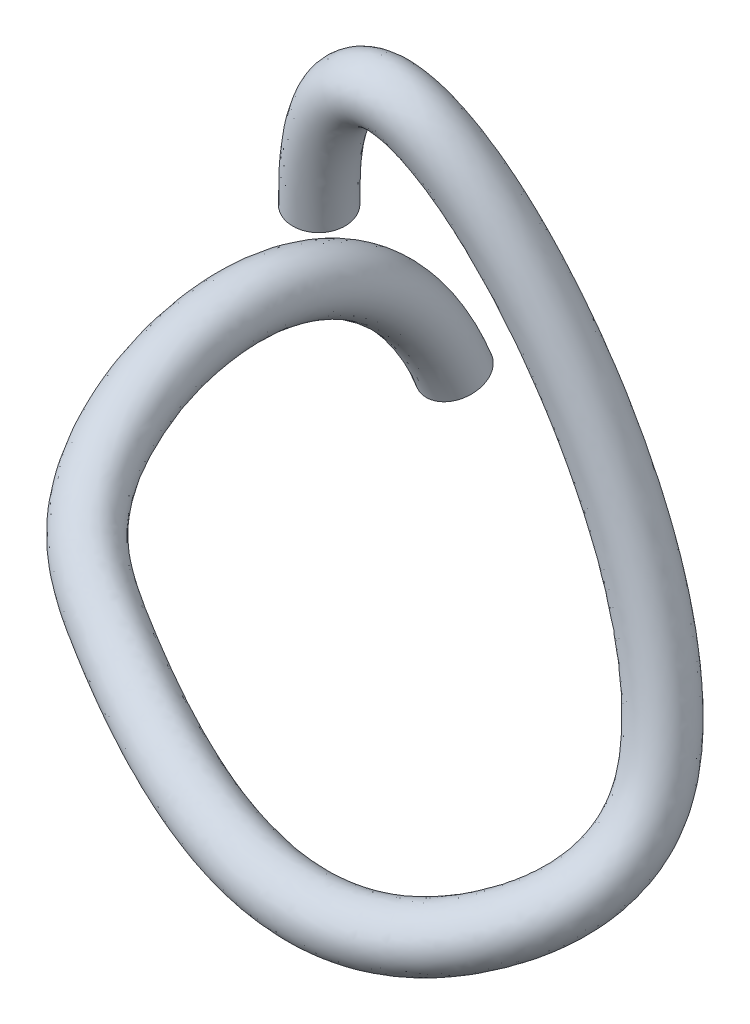
ISO-10303-21;
HEADER;
FILE_DESCRIPTION(('STEP AP214'),'2;1');
FILE_NAME('part.step','',(''),(''),'','','');
FILE_SCHEMA(('AUTOMOTIVE_DESIGN { 1 0 10303 214 1 1 1 1 }'));
ENDSEC;
DATA;
#1=APPLICATION_CONTEXT('core data for automotive mechanical design processes');
#2=APPLICATION_PROTOCOL_DEFINITION('international standard','automotive_design',2000,#1);
#3=PRODUCT_CONTEXT('',#1,'mechanical');
#4=PRODUCT('Part','Part','',(#3));
#5=PRODUCT_RELATED_PRODUCT_CATEGORY('part','',(#4));
#6=PRODUCT_DEFINITION_FORMATION('','',#4);
#7=PRODUCT_DEFINITION_CONTEXT('part definition',#1,'design');
#8=PRODUCT_DEFINITION('design','',#6,#7);
#9=PRODUCT_DEFINITION_SHAPE('','',#8);
#10=(LENGTH_UNIT() NAMED_UNIT(*) SI_UNIT(.MILLI.,.METRE.));
#11=(NAMED_UNIT(*) PLANE_ANGLE_UNIT() SI_UNIT($,.RADIAN.));
#12=(NAMED_UNIT(*) SI_UNIT($,.STERADIAN.) SOLID_ANGLE_UNIT());
#13=UNCERTAINTY_MEASURE_WITH_UNIT(LENGTH_MEASURE(1.E-05),#10,'distance_accuracy_value','');
#14=(GEOMETRIC_REPRESENTATION_CONTEXT(3) GLOBAL_UNCERTAINTY_ASSIGNED_CONTEXT((#13)) GLOBAL_UNIT_ASSIGNED_CONTEXT((#10,
#11,#12)) REPRESENTATION_CONTEXT('',''));
#15=CARTESIAN_POINT('',(0.,0.,0.));
#16=DIRECTION('',(0.,0.,1.));
#17=DIRECTION('',(1.,0.,0.));
#18=AXIS2_PLACEMENT_3D('',#15,#16,#17);
#19=CARTESIAN_POINT('',(-13.0347942416813,-226.512822725171,50.1244016321392));
#20=DIRECTION('',(-0.0721003246890326,0.938055885866754,0.338899244865603));
#21=DIRECTION('',(0.,-0.339783570756016,0.940503654987205));
#22=AXIS2_PLACEMENT_3D('',#19,#20,#21);
#23=PLANE('',#22);
#24=CARTESIAN_POINT('',(-13.0347942416813,-226.512822725171,50.1244016321392));
#25=DIRECTION('',(-0.0721003246890326,0.938055885866754,0.338899244865603));
#26=DIRECTION('',(0.,-0.339783570756016,0.940503654987205));
#27=AXIS2_PLACEMENT_3D('',#24,#25,#26);
#28=CIRCLE('',#27,1.25);
#29=CARTESIAN_POINT('',(-13.0347942416813,-226.937552188616,51.3000312008732));
#30=VERTEX_POINT('',#29);
#31=EDGE_CURVE('E48',#30,#30,#28,.T.);
#32=ORIENTED_EDGE('',*,*,#31,.F.);
#33=EDGE_LOOP('',(#32));
#34=FACE_BOUND('',#33,.T.);
#35=ADVANCED_FACE('F41',(#34),#23,.F.);
#36=CARTESIAN_POINT('',(-3.27200878484372,-207.550376313092,65.7574694621777));
#37=DIRECTION('',(-0.0945658701813724,-0.989253149180793,-0.111514586636561));
#38=DIRECTION('',(0.467990372308488,0.054692128097858,-0.882039558381986));
#39=AXIS2_PLACEMENT_3D('',#36,#37,#38);
#40=PLANE('',#39);
#41=CARTESIAN_POINT('',(-3.27200878484372,-207.550376313092,65.7574694621777));
#42=DIRECTION('',(-0.0945658701813724,-0.989253149180793,-0.111514586636561));
#43=DIRECTION('',(0.467990372308488,0.054692128097858,-0.882039558381986));
#44=AXIS2_PLACEMENT_3D('',#41,#42,#43);
#45=CIRCLE('',#44,1.25);
#46=CARTESIAN_POINT('',(-2.68702081945811,-207.48201115297,64.6549200142002));
#47=VERTEX_POINT('',#46);
#48=EDGE_CURVE('E12',#47,#47,#45,.T.);
#49=ORIENTED_EDGE('',*,*,#48,.T.);
#50=EDGE_LOOP('',(#49));
#51=FACE_BOUND('',#50,.T.);
#52=ADVANCED_FACE('F55',(#51),#40,.T.);
#53=CARTESIAN_POINT('',(-13.0347942416813,-226.937552188616,51.3000312008732));
#54=CARTESIAN_POINT('',(-13.1690798212002,-224.76631906985,52.084450636396));
#55=CARTESIAN_POINT('',(-13.3466605089802,-223.494945827811,53.1496145481935));
#56=CARTESIAN_POINT('',(-13.6176370953907,-221.9748409091,55.492303441265));
#57=CARTESIAN_POINT('',(-13.719968757025,-221.708627472003,56.8187300855496));
#58=CARTESIAN_POINT('',(-13.6693163469916,-221.748257150503,58.9272635334938));
#59=CARTESIAN_POINT('',(-13.6166102951518,-221.835587653315,59.6449846491448));
#60=CARTESIAN_POINT('',(-13.4301436293276,-222.099472792696,61.0586234307728));
#61=CARTESIAN_POINT('',(-13.2972780490025,-222.274552752187,61.754991806822));
#62=CARTESIAN_POINT('',(-12.9728804612941,-222.674799221792,63.0647972710129));
#63=CARTESIAN_POINT('',(-12.782650472939,-222.90253638215,63.6775997819816));
#64=CARTESIAN_POINT('',(-12.3460506194197,-223.385018493212,64.7422225343464));
#65=CARTESIAN_POINT('',(-12.0974562343204,-223.638544362689,65.1923850043142));
#66=CARTESIAN_POINT('',(-11.6770116327616,-223.994686494845,65.7136768213109));
#67=CARTESIAN_POINT('',(-11.5166489903006,-224.110737381236,65.8769367592622));
#68=CARTESIAN_POINT('',(-11.2476827252521,-224.270788829762,66.1210171185453));
#69=CARTESIAN_POINT('',(-11.1533269946278,-224.321776425026,66.2022049324256));
#70=CARTESIAN_POINT('',(-10.9555780864416,-224.416897287701,66.3693314516303));
#71=CARTESIAN_POINT('',(-10.8522278202061,-224.459340416791,66.4576496603135));
#72=CARTESIAN_POINT('',(-10.5375645712517,-224.628261446071,66.6799852633233));
#73=CARTESIAN_POINT('',(-10.3176733701941,-224.784213740087,66.7775896445653));
#74=CARTESIAN_POINT('',(-9.84495487862731,-225.070963832184,66.9897990615661));
#75=CARTESIAN_POINT('',(-9.59383216866633,-225.212154383585,67.0945263043057));
#76=CARTESIAN_POINT('',(-7.97766933700305,-226.055607980373,67.7693424327877));
#77=CARTESIAN_POINT('',(-6.47183229033444,-226.574553732821,68.402568755281));
#78=CARTESIAN_POINT('',(-4.13902735044166,-227.098328901101,69.2633241053463));
#79=CARTESIAN_POINT('',(-3.3492040202668,-227.230581173186,69.5353723483892));
#80=CARTESIAN_POINT('',(-2.16674494678162,-227.369814967006,69.8976036968864));
#81=CARTESIAN_POINT('',(-1.77313125231292,-227.404846318559,70.0113750007578));
#82=CARTESIAN_POINT('',(-0.982078892198437,-227.512883271243,70.1753355992218));
#83=CARTESIAN_POINT('',(-0.58720038448331,-227.571232406946,70.2396605741553));
#84=CARTESIAN_POINT('',(1.36037565532965,-227.779485220413,70.546191718046));
#85=CARTESIAN_POINT('',(2.84554819546331,-227.76939869547,70.6563760304991));
#86=CARTESIAN_POINT('',(4.80327750262762,-227.553034866903,70.4291402402458));
#87=CARTESIAN_POINT('',(5.41092588924908,-227.448884685819,70.2899660074702));
#88=CARTESIAN_POINT('',(6.25095151613049,-227.253895249537,69.9707786883891));
#89=CARTESIAN_POINT('',(6.51927955821612,-227.182370047776,69.8459610517992));
#90=CARTESIAN_POINT('',(7.03391180615321,-227.026593768275,69.5552656222028));
#91=CARTESIAN_POINT('',(7.28144172655081,-226.946907473032,69.3883603640673));
#92=CARTESIAN_POINT('',(8.19101129644953,-226.557461743263,68.6586777380479));
#93=CARTESIAN_POINT('',(8.82281294284266,-226.200524744857,67.8726849736074));
#94=CARTESIAN_POINT('',(9.47504844203213,-225.303072024909,66.6777740701201));
#95=CARTESIAN_POINT('',(9.64485672902227,-224.942972785224,66.2767216843067));
#96=CARTESIAN_POINT('',(9.85800472199643,-224.045106535431,65.5266825254428));
#97=CARTESIAN_POINT('',(9.90130851748301,-223.506728234627,65.1773634678194));
#98=CARTESIAN_POINT('',(9.80770671590474,-221.874109477864,64.4554722936217));
#99=CARTESIAN_POINT('',(9.57206357289042,-220.646864929803,64.1612416050175));
#100=CARTESIAN_POINT('',(8.82267439001896,-217.918075184918,63.7951025071716));
#101=CARTESIAN_POINT('',(8.30935303737227,-216.416745917683,63.7226206697046));
#102=CARTESIAN_POINT('',(7.09393413734342,-213.365591653081,63.7345160479404));
#103=CARTESIAN_POINT('',(6.39173705074274,-211.815575420424,63.8188401649754));
#104=CARTESIAN_POINT('',(5.45345913016973,-209.98890253157,63.9803037118888));
#105=CARTESIAN_POINT('',(5.26252766533159,-209.629343021333,64.0161221600944));
#106=CARTESIAN_POINT('',(4.87724247340856,-208.924019671841,64.0893111871977));
#107=CARTESIAN_POINT('',(4.68892267651283,-208.572999154489,64.1097097943609));
#108=CARTESIAN_POINT('',(4.12532309533547,-207.540107295297,64.1653266959525));
#109=CARTESIAN_POINT('',(3.74358534064665,-206.885824089556,64.2145071262359));
#110=CARTESIAN_POINT('',(2.59422862812943,-205.075143760298,64.3883505182109));
#111=CARTESIAN_POINT('',(1.81649244943295,-204.071435259621,64.5405236135607));
#112=CARTESIAN_POINT('',(0.751870708468586,-203.064457627526,64.7478982977373));
#113=CARTESIAN_POINT('',(0.415007094224127,-202.81291549402,64.8131347028483));
#114=CARTESIAN_POINT('',(-0.171978771830177,-202.493703368036,64.9193998067493));
#115=CARTESIAN_POINT('',(-0.415425350955713,-202.428535692913,64.9590376902359));
#116=CARTESIAN_POINT('',(-0.786959570439137,-202.417135825651,65.009880192269));
#117=CARTESIAN_POINT('',(-0.924273337235937,-202.453130160138,65.0244816337622));
#118=CARTESIAN_POINT('',(-1.27217598950491,-202.697000163808,65.0460814623679));
#119=CARTESIAN_POINT('',(-1.4799189917512,-202.924750302478,65.0504901953339));
#120=CARTESIAN_POINT('',(-1.89331068788754,-203.694465765578,65.019600735039));
#121=CARTESIAN_POINT('',(-2.09506348981743,-204.230373145043,64.9843143778643));
#122=CARTESIAN_POINT('',(-2.43926585104946,-205.61713220408,64.8609420953337));
#123=CARTESIAN_POINT('',(-2.58281647181509,-206.467343193548,64.7731244415885));
#124=CARTESIAN_POINT('',(-2.6870208194581,-207.48201115297,64.6549200142002));
#125=CARTESIAN_POINT('',(-10.541300779714,-226.768025641377,51.361277465312));
#126=CARTESIAN_POINT('',(-10.6810241193302,-224.503949720436,52.1100979920895));
#127=CARTESIAN_POINT('',(-10.8730608255717,-223.102877882465,53.1684901487536));
#128=CARTESIAN_POINT('',(-11.2086626957866,-221.294058852035,55.5707068015353));
#129=CARTESIAN_POINT('',(-11.3513173990001,-220.871226589479,56.9429567256571));
#130=CARTESIAN_POINT('',(-11.4815658807695,-220.555279725331,59.171902435251));
#131=CARTESIAN_POINT('',(-11.5128297354039,-220.502436265268,59.9420616712864));
#132=CARTESIAN_POINT('',(-11.5706544640441,-220.475792859077,61.5029245994777));
#133=CARTESIAN_POINT('',(-11.6010557112487,-220.503232425246,62.2949864851014));
#134=CARTESIAN_POINT('',(-11.6386854195622,-220.686726169212,63.8223124863836));
#135=CARTESIAN_POINT('',(-11.6420882089123,-220.848579524687,64.5547177890014));
#136=CARTESIAN_POINT('',(-11.5228465122676,-221.291590411002,65.8507580221724));
#137=CARTESIAN_POINT('',(-11.3984458570942,-221.56817126276,66.4142010268368));
#138=CARTESIAN_POINT('',(-11.0871309651592,-221.993188781706,67.0923941848591));
#139=CARTESIAN_POINT('',(-10.9689737864074,-222.137521744089,67.3147786611481));
#140=CARTESIAN_POINT('',(-10.789921607579,-222.361877166065,67.6699652646272));
#141=CARTESIAN_POINT('',(-10.7299198694282,-222.438064371471,67.79193165938));
#142=CARTESIAN_POINT('',(-10.6147828795726,-222.597683274898,68.0513524751523));
#143=CARTESIAN_POINT('',(-10.5630198030478,-222.6834188203,68.1939740606117));
#144=CARTESIAN_POINT('',(-10.3275532763132,-222.933230401469,68.5081565013111));
#145=CARTESIAN_POINT('',(-10.0839589465742,-223.078424574689,68.5902606749585));
#146=CARTESIAN_POINT('',(-9.62822084060818,-223.354625214621,68.7946047236319));
#147=CARTESIAN_POINT('',(-9.39683707007131,-223.484134147521,68.8907862890007));
#148=CARTESIAN_POINT('',(-7.9725393625002,-224.22745501154,69.4854896528661));
#149=CARTESIAN_POINT('',(-6.57996834568991,-224.715186573624,70.0722857361876));
#150=CARTESIAN_POINT('',(-4.36152550266758,-225.213324756328,70.8908920934721));
#151=CARTESIAN_POINT('',(-3.60054778906595,-225.341279340503,71.1533315013584));
#152=CARTESIAN_POINT('',(-2.44756073998767,-225.477097936733,71.5066007339115));
#153=CARTESIAN_POINT('',(-2.06101353523742,-225.512953582119,71.6215689279857));
#154=CARTESIAN_POINT('',(-1.24950272779816,-225.5327910033,71.6795223874102));
#155=CARTESIAN_POINT('',(-0.839089091593463,-225.53055006371,71.6638955333949));
#156=CARTESIAN_POINT('',(1.14711122493716,-225.520348373061,71.6422118267606));
#157=CARTESIAN_POINT('',(2.59921743603147,-225.43991500494,71.5436374588772));
#158=CARTESIAN_POINT('',(4.45262941821452,-225.172751911377,71.1128071633246));
#159=CARTESIAN_POINT('',(5.01645700942624,-225.061824960932,70.9223788664973));
#160=CARTESIAN_POINT('',(5.78472743169138,-224.866534820615,70.5487464631963));
#161=CARTESIAN_POINT('',(6.02817182104778,-224.796582160494,70.4095110045112));
#162=CARTESIAN_POINT('',(6.49267657655975,-224.646525053357,70.0966495345879));
#163=CARTESIAN_POINT('',(6.70851736429149,-224.571007032114,69.9147845529127));
#164=CARTESIAN_POINT('',(7.57094670107289,-224.201731209992,69.2228513825563));
#165=CARTESIAN_POINT('',(8.03404234379778,-223.904010407858,68.5989059849554));
#166=CARTESIAN_POINT('',(8.43604593935213,-223.350584206655,67.861686491109));
#167=CARTESIAN_POINT('',(8.52445362177333,-223.154191934073,67.6466596895161));
#168=CARTESIAN_POINT('',(8.63492130999744,-222.688210286839,67.257193926087));
#169=CARTESIAN_POINT('',(8.65978943807679,-222.417083409995,67.0766450422916));
#170=CARTESIAN_POINT('',(8.60440063910574,-221.450985470985,66.6494676549402));
#171=CARTESIAN_POINT('',(8.43326591890644,-220.465652645329,66.3872629553424));
#172=CARTESIAN_POINT('',(7.78198323127419,-218.094009252198,66.0690590074159));
#173=CARTESIAN_POINT('',(7.31182285948146,-216.709794136406,65.9986066066366));
#174=CARTESIAN_POINT('',(6.17423846025647,-213.8539960097,66.009747189274));
#175=CARTESIAN_POINT('',(5.50716526394915,-212.379987318661,66.0893979458974));
#176=CARTESIAN_POINT('',(4.61466533156803,-210.642405748342,66.2429928865646));
#177=CARTESIAN_POINT('',(4.43430836226741,-210.299673989056,66.2777821571881));
#178=CARTESIAN_POINT('',(4.06527188163111,-209.630368214622,66.3458953882653));
#179=CARTESIAN_POINT('',(3.85210702023676,-209.313841939638,66.3466696870516));
#180=CARTESIAN_POINT('',(3.19716957379296,-208.397636493784,66.3253190250452));
#181=CARTESIAN_POINT('',(2.76668932551185,-207.820010294296,66.319914017756));
#182=CARTESIAN_POINT('',(1.52231551775178,-206.239933607139,66.3334310754509));
#183=CARTESIAN_POINT('',(0.738693338791091,-205.389711397094,66.3882446694281));
#184=CARTESIAN_POINT('',(-0.129848158447466,-204.67238019995,66.451732452925));
#185=CARTESIAN_POINT('',(-0.365733718586637,-204.530317714242,66.4680982923781));
#186=CARTESIAN_POINT('',(-0.591565394208493,-204.430326615694,66.4593246234741));
#187=CARTESIAN_POINT('',(-0.559020528139004,-204.480878267273,66.4294499434642));
#188=CARTESIAN_POINT('',(-0.183474799502697,-204.484459522868,66.3353311997143));
#189=CARTESIAN_POINT('',(0.128369444035149,-204.377492765231,66.2825279478304));
#190=CARTESIAN_POINT('',(0.394943463970075,-204.182010715477,66.2332484445985));
#191=CARTESIAN_POINT('',(0.35928747485309,-204.160595302125,66.2280151225327));
#192=CARTESIAN_POINT('',(0.155937902550499,-204.553509921655,66.1854402042996));
#193=CARTESIAN_POINT('',(0.00140650701237655,-204.947385250514,66.1481326284211));
#194=CARTESIAN_POINT('',(-0.274859115599343,-206.109672497514,66.0170187705476));
#195=CARTESIAN_POINT('',(-0.400302410000975,-206.875918733193,65.92411615686));
#196=CARTESIAN_POINT('',(-0.490372367236806,-207.821007631196,65.7993923664673));
#197=CARTESIAN_POINT('',(-10.541300779714,-225.918566714487,49.0100183278439));
#198=CARTESIAN_POINT('',(-10.7764604415032,-223.261064932097,49.9009750823326));
#199=CARTESIAN_POINT('',(-11.1102412084608,-221.354403057542,51.2962991246934));
#200=CARTESIAN_POINT('',(-11.8151747440314,-218.953430037249,54.6920044242868));
#201=CARTESIAN_POINT('',(-12.1675455352585,-218.478997366816,56.6230078043129));
#202=CARTESIAN_POINT('',(-12.6975319637898,-218.372880660613,59.434390326209));
#203=CARTESIAN_POINT('',(-12.8798296381704,-218.43592778752,60.3659575114798));
#204=CARTESIAN_POINT('',(-13.250578887104,-218.737143847921,62.1912466504032));
#205=CARTESIAN_POINT('',(-13.4410807750773,-218.979501667813,63.0854253944296));
#206=CARTESIAN_POINT('',(-13.7214521323526,-219.653335134803,64.7848233250445));
#207=CARTESIAN_POINT('',(-13.8048918999445,-220.085468680641,65.5884528711494));
#208=CARTESIAN_POINT('',(-13.7196711826948,-221.061850438838,67.0548539896595));
#209=CARTESIAN_POINT('',(-13.5537035750034,-221.603960157446,67.7207491931765));
#210=CARTESIAN_POINT('',(-13.0510705150474,-222.439071999776,68.5830202533597));
#211=CARTESIAN_POINT('',(-12.8632133916501,-222.725598951653,68.8453460104686));
#212=CARTESIAN_POINT('',(-12.5894392152431,-223.175545330449,69.205000840023));
#213=CARTESIAN_POINT('',(-12.4994279771059,-223.329030333116,69.319290779616));
#214=CARTESIAN_POINT('',(-12.328316057422,-223.651332169049,69.5384413086769));
#215=CARTESIAN_POINT('',(-12.2505017213794,-223.825833127925,69.6437100404706));
#216=CARTESIAN_POINT('',(-11.9275221804759,-224.249768607595,69.9133565665157));
#217=CARTESIAN_POINT('',(-11.6210383756641,-224.412383424923,70.0433882595319));
#218=CARTESIAN_POINT('',(-11.0689669848621,-224.746792426489,70.2911875567547));
#219=CARTESIAN_POINT('',(-10.8007302308048,-224.896303572975,70.4026524099439));
#220=CARTESIAN_POINT('',(-9.22510861597287,-225.718597488233,71.0605406892903));
#221=CARTESIAN_POINT('',(-7.70313158693602,-226.251168279847,71.7019076966928));
#222=CARTESIAN_POINT('',(-5.26092801245934,-226.799590969925,72.603035611134));
#223=CARTESIAN_POINT('',(-4.42018167375,-226.941275747447,72.8931387725492));
#224=CARTESIAN_POINT('',(-3.13411653158656,-227.09282889913,73.2871158247516));
#225=CARTESIAN_POINT('',(-2.70065241453656,-227.136164227881,73.4141866130163));
#226=CARTESIAN_POINT('',(-1.8059273394939,-227.055365087648,73.5846703192508));
#227=CARTESIAN_POINT('',(-1.35409602854429,-226.974320833264,73.6411997620675));
#228=CARTESIAN_POINT('',(0.870583163827964,-226.641476122046,73.8933484088054));
#229=CARTESIAN_POINT('',(2.58807311065107,-226.350346914475,73.909084084077));
#230=CARTESIAN_POINT('',(4.98834135129146,-225.777992487375,73.4877352909606));
#231=CARTESIAN_POINT('',(5.75909740841952,-225.564123624503,73.2694907627717));
#232=CARTESIAN_POINT('',(6.84727054322133,-225.202460381383,72.7901398669274));
#233=CARTESIAN_POINT('',(7.19847952546943,-225.075192704942,72.6050342952008));
#234=CARTESIAN_POINT('',(7.87217245579702,-224.807530354864,72.1795885369125));
#235=CARTESIAN_POINT('',(8.1869854019678,-224.662592543005,71.933064313552));
#236=CARTESIAN_POINT('',(9.43257223789835,-224.1291950507,70.9337529949111));
#237=CARTESIAN_POINT('',(10.0330073815259,-223.731639918324,70.1049576873804));
#238=CARTESIAN_POINT('',(10.5603809152286,-223.005164228053,69.1379415940063));
#239=CARTESIAN_POINT('',(10.6738568054488,-222.748420073055,68.8594191939055));
#240=CARTESIAN_POINT('',(10.8104814141375,-222.171623925533,68.3776613435294));
#241=CARTESIAN_POINT('',(10.8365100885872,-221.851257034447,68.1689805096336));
#242=CARTESIAN_POINT('',(10.7761258063296,-220.798028796891,67.7032771311739));
#243=CARTESIAN_POINT('',(10.5955037924885,-219.771980133085,67.4337086760736));
#244=CARTESIAN_POINT('',(9.92387126527535,-217.326190368767,67.1055302490327));
#245=CARTESIAN_POINT('',(9.44199896584185,-215.908112841053,67.033613984495));
#246=CARTESIAN_POINT('',(8.27496925784188,-212.978378518516,67.0450285716685));
#247=CARTESIAN_POINT('',(7.59036175144624,-211.464678495349,67.1265233996176));
#248=CARTESIAN_POINT('',(6.66602790455282,-209.665106907739,67.2855829359941));
#249=CARTESIAN_POINT('',(6.47930695513218,-209.308892954809,67.3201774643246));
#250=CARTESIAN_POINT('',(6.09400798745263,-208.612808867792,67.3942546144145));
#251=CARTESIAN_POINT('',(5.85887675695586,-208.293499825513,67.4351315193525));
#252=CARTESIAN_POINT('',(5.12383030116242,-207.380541094435,67.556328065671));
#253=CARTESIAN_POINT('',(4.63663306469888,-206.805702492911,67.6365249434567));
#254=CARTESIAN_POINT('',(3.21706040256968,-205.21953383865,67.873730080925));
#255=CARTESIAN_POINT('',(2.32185599835922,-204.34493859677,68.0310962399079));
#256=CARTESIAN_POINT('',(1.18581193444894,-203.502230106383,68.2297977340163));
#257=CARTESIAN_POINT('',(0.842044217518011,-203.301533100521,68.2889476189025));
#258=CARTESIAN_POINT('',(0.28332835334236,-203.074077008461,68.3774693775272));
#259=CARTESIAN_POINT('',(0.0775198288966146,-203.050793518194,68.4048877204846));
#260=CARTESIAN_POINT('',(-0.1762453446901,-203.081146013576,68.4289737535316));
#261=CARTESIAN_POINT('',(-0.236906378412235,-203.110332537836,68.4302886236323));
#262=CARTESIAN_POINT('',(-0.46892801851899,-203.310471018077,68.4346439552822));
#263=CARTESIAN_POINT('',(-0.636366173298213,-203.50877387257,68.4341066669617));
#264=CARTESIAN_POINT('',(-0.985853143004668,-204.234535419656,68.3939704376251));
#265=CARTESIAN_POINT('',(-1.16253156363872,-204.753655274629,68.3543818519005));
#266=CARTESIAN_POINT('',(-1.45833127685155,-206.113147866679,68.2213781658164));
#267=CARTESIAN_POINT('',(-1.57895951736781,-206.952636292893,68.1283301930753));
#268=CARTESIAN_POINT('',(-1.66034829800802,-207.957737951441,68.0044912624222));
#269=CARTESIAN_POINT('',(-13.0347942416813,-226.088093261726,48.9487720634052));
#270=CARTESIAN_POINT('',(-13.2645161433743,-223.523434281353,49.8753277266522));
#271=CARTESIAN_POINT('',(-13.5838408918722,-221.746471002899,51.2774235241216));
#272=CARTESIAN_POINT('',(-14.2241491436324,-219.634212094303,54.6136010640282));
#273=CARTESIAN_POINT('',(-14.5361968932835,-219.316398249329,56.4987811641943));
#274=CARTESIAN_POINT('',(-14.8852824300119,-219.565858085791,59.1897514244574));
#275=CARTESIAN_POINT('',(-14.9836101979197,-219.769079175562,60.0688804893327));
#276=CARTESIAN_POINT('',(-15.1100680523861,-220.360823781545,61.746945481704));
#277=CARTESIAN_POINT('',(-15.1373031128312,-220.750821994749,62.5454307161449));
#278=CARTESIAN_POINT('',(-15.0556471740844,-221.641408187388,64.0273081096792));
#279=CARTESIAN_POINT('',(-14.9454541639712,-222.1394255381,64.7113348641347));
#280=CARTESIAN_POINT('',(-14.542875289847,-223.155278521054,65.9463185018286));
#281=CARTESIAN_POINT('',(-14.2527139522274,-223.674333257375,66.4989331706539));
#282=CARTESIAN_POINT('',(-13.640951182651,-224.440569712915,67.2043028898116));
#283=CARTESIAN_POINT('',(-13.4108885955422,-224.6988145888,67.4075041085783));
#284=CARTESIAN_POINT('',(-13.0472003329167,-225.084456994147,67.6560526939434));
#285=CARTESIAN_POINT('',(-12.9228351023058,-225.212742386671,67.7295640526617));
#286=CARTESIAN_POINT('',(-12.6691112642907,-225.470546181852,67.8564202851549));
#287=CARTESIAN_POINT('',(-12.5397097385382,-225.601754724415,67.9073856401725));
#288=CARTESIAN_POINT('',(-12.1375334754132,-225.944799652199,68.0851853285279));
#289=CARTESIAN_POINT('',(-11.8547527992806,-226.118172590321,68.230717229141));
#290=CARTESIAN_POINT('',(-11.2857010228846,-226.463131044053,68.4863818946866));
#291=CARTESIAN_POINT('',(-10.9977253293999,-226.624323809042,68.6063924252489));
#292=CARTESIAN_POINT('',(-9.23023859047573,-227.546750457054,69.3443934692119));
#293=CARTESIAN_POINT('',(-7.59499553156818,-228.110535439069,70.0321907157739));
#294=CARTESIAN_POINT('',(-5.03842986023952,-228.684595114685,70.9754676230145));
#295=CARTESIAN_POINT('',(-4.16883790495693,-228.830577580125,71.2751796195921));
#296=CARTESIAN_POINT('',(-2.85330073837746,-228.985545929405,71.6781187877204));
#297=CARTESIAN_POINT('',(-2.41277013160906,-229.028056964315,71.8039926857884));
#298=CARTESIAN_POINT('',(-1.53850350389718,-229.035457355597,72.0804835310623));
#299=CARTESIAN_POINT('',(-1.10220732143115,-229.015003176497,72.2169648028279));
#300=CARTESIAN_POINT('',(1.08384759420877,-228.90061296941,72.7973283000908));
#301=CARTESIAN_POINT('',(2.83440387009345,-228.679830605005,73.0218226556883));
#302=CARTESIAN_POINT('',(5.33898943569933,-228.1582754429,72.8040683678871));
#303=CARTESIAN_POINT('',(6.15356628823732,-227.95118334939,72.6370779037472));
#304=CARTESIAN_POINT('',(7.31349462766304,-227.589820810305,72.2121720921189));
#305=CARTESIAN_POINT('',(7.68958726264039,-227.460980592224,72.0414843424888));
#306=CARTESIAN_POINT('',(8.41340768538797,-227.187599069783,71.6382046245274));
#307=CARTESIAN_POINT('',(8.75990976422447,-227.03849298392,71.4066401247092));
#308=CARTESIAN_POINT('',(10.0526368332827,-226.484925583978,70.369579350395));
#309=CARTESIAN_POINT('',(10.8217779805626,-226.028154255322,69.3787366760365));
#310=CARTESIAN_POINT('',(11.5993834179127,-224.957652046307,67.9540291730153));
#311=CARTESIAN_POINT('',(11.7942599127021,-224.537200924215,67.4894811886961));
#312=CARTESIAN_POINT('',(12.0335648261321,-223.528520174116,66.6471499428851));
#313=CARTESIAN_POINT('',(12.0780291679934,-222.940901859089,66.2696989351589));
#314=CARTESIAN_POINT('',(11.9794318831286,-221.221152803754,65.5092817698593));
#315=CARTESIAN_POINT('',(11.734301446475,-219.953192417579,65.2076873257487));
#316=CARTESIAN_POINT('',(10.9645624240176,-217.150256301466,64.8315737487884));
#317=CARTESIAN_POINT('',(10.4395291437298,-215.615064622331,64.7576280475629));
#318=CARTESIAN_POINT('',(9.1946649349317,-212.489974161897,64.7697974303349));
#319=CARTESIAN_POINT('',(8.47493353823692,-210.900266597112,64.8559656186956));
#320=CARTESIAN_POINT('',(7.50482170315523,-209.011603690967,65.0228937613183));
#321=CARTESIAN_POINT('',(7.30752625819707,-208.638561987083,65.0585174672309));
#322=CARTESIAN_POINT('',(6.90597857922937,-207.906460325014,65.1376704133469));
#323=CARTESIAN_POINT('',(6.69569241323263,-207.552657040366,65.1981716266604));
#324=CARTESIAN_POINT('',(6.05198382270354,-206.523011895941,65.3963357365811));
#325=CARTESIAN_POINT('',(5.6135290798324,-205.871516288166,65.5311180519366));
#326=CARTESIAN_POINT('',(4.28897351294989,-204.054743991819,65.928649523685));
#327=CARTESIAN_POINT('',(3.3996551089973,-203.026662459275,66.1833751840254));
#328=CARTESIAN_POINT('',(2.06753080136686,-201.89430753397,66.5259635788362));
#329=CARTESIAN_POINT('',(1.62278503032727,-201.584130880296,66.6339840293728));
#330=CARTESIAN_POINT('',(0.702914975722153,-201.137453760806,66.8375445608024));
#331=CARTESIAN_POINT('',(0.221115006082319,-200.998450943833,66.9344754672538));
#332=CARTESIAN_POINT('',(-0.779730115628953,-201.013822316359,67.1035227460887));
#333=CARTESIAN_POINT('',(-1.28954915967819,-201.185969932743,67.1722423095641));
#334=CARTESIAN_POINT('',(-2.13604747199916,-201.825460466408,67.2474769730516));
#335=CARTESIAN_POINT('',(-2.47557263990436,-202.272928872923,67.256581739763));
#336=CARTESIAN_POINT('',(-3.0351017334409,-203.37549126358,67.2281309683645));
#337=CARTESIAN_POINT('',(-3.2590015604712,-204.036643169157,67.1905636013437));
#338=CARTESIAN_POINT('',(-3.62273801229902,-205.620607573245,67.0653014906026));
#339=CARTESIAN_POINT('',(-3.76147357918926,-206.544060753248,66.9773384778148));
#340=CARTESIAN_POINT('',(-3.85699675022933,-207.618741473214,66.8600189101552));
#341=CARTESIAN_POINT('',(-15.5282877036485,-226.257619808966,48.8875257989664));
#342=CARTESIAN_POINT('',(-15.7525718452454,-223.785803630609,49.8496803709719));
#343=CARTESIAN_POINT('',(-16.0574405752837,-222.138538948257,51.2585479235497));
#344=CARTESIAN_POINT('',(-16.6331235432335,-220.314994151356,54.5351977037696));
#345=CARTESIAN_POINT('',(-16.9048482513084,-220.153799131842,56.3745545240756));
#346=CARTESIAN_POINT('',(-17.0730328962339,-220.758835510969,58.9451125227057));
#347=CARTESIAN_POINT('',(-17.0873907576689,-221.102230563603,59.7718034671854));
#348=CARTESIAN_POINT('',(-16.9695572176682,-221.98450371517,61.3026443130047));
#349=CARTESIAN_POINT('',(-16.833525450585,-222.522142321685,62.0054360378602));
#350=CARTESIAN_POINT('',(-16.3898422158163,-223.629481239973,63.2697928943139));
#351=CARTESIAN_POINT('',(-16.0860164279979,-224.193382395558,63.8342168571199));
#352=CARTESIAN_POINT('',(-15.3660793969991,-225.248706603269,64.8377830139977));
#353=CARTESIAN_POINT('',(-14.9517243294514,-225.744706357303,65.2771171481313));
#354=CARTESIAN_POINT('',(-14.2308318502545,-226.442067426055,65.8255855262634));
#355=CARTESIAN_POINT('',(-13.9585637994342,-226.672030225947,65.9696622066879));
#356=CARTESIAN_POINT('',(-13.5049614505904,-226.993368657844,66.1071045478638));
#357=CARTESIAN_POINT('',(-13.3462422275056,-227.096454440226,66.1398373257073));
#358=CARTESIAN_POINT('',(-13.0099064711594,-227.289760194655,66.1743992616329));
#359=CARTESIAN_POINT('',(-12.8289177556971,-227.377676320905,66.1710612398743));
#360=CARTESIAN_POINT('',(-12.3475447703506,-227.639830696804,66.25701409054));
#361=CARTESIAN_POINT('',(-12.0884672228971,-227.82396175572,66.41804619875));
#362=CARTESIAN_POINT('',(-11.5024350609072,-228.179469661616,66.6815762326185));
#363=CARTESIAN_POINT('',(-11.1947204279949,-228.352344045109,66.8101324405539));
#364=CARTESIAN_POINT('',(-9.23536856497857,-229.374903425875,67.6282462491335));
#365=CARTESIAN_POINT('',(-7.48685947620039,-229.969902598292,68.362473734855));
#366=CARTESIAN_POINT('',(-4.81593170801976,-230.569599259445,69.3478996348949));
#367=CARTESIAN_POINT('',(-3.91749413616388,-230.719879412803,69.657220466635));
#368=CARTESIAN_POINT('',(-2.57248494516839,-230.878262959681,70.0691217506892));
#369=CARTESIAN_POINT('',(-2.12488784868159,-230.91994970075,70.1937987585605));
#370=CARTESIAN_POINT('',(-1.27107966830048,-231.015549623547,70.5762967428739));
#371=CARTESIAN_POINT('',(-0.850318614317978,-231.05568551973,70.7927298435883));
#372=CARTESIAN_POINT('',(1.29711202458961,-231.159749816773,71.7013081913762));
#373=CARTESIAN_POINT('',(3.08073462953583,-231.009314295534,72.1345612272997));
#374=CARTESIAN_POINT('',(5.6896375201072,-230.538558398426,72.1204014448135));
#375=CARTESIAN_POINT('',(6.54803516805503,-230.338243074277,72.0046650447227));
#376=CARTESIAN_POINT('',(7.77971871210467,-229.977181239227,71.6342043173104));
#377=CARTESIAN_POINT('',(8.18069499981133,-229.846768479506,71.4779343897768));
#378=CARTESIAN_POINT('',(8.95464291497889,-229.567667784701,71.0968207121423));
#379=CARTESIAN_POINT('',(9.33283412648117,-229.414393424835,70.8802159358664));
#380=CARTESIAN_POINT('',(10.672701428667,-228.840656117256,69.805405705879));
#381=CARTESIAN_POINT('',(11.6105485795992,-228.324668592321,68.6525156646926));
#382=CARTESIAN_POINT('',(12.6383859205969,-226.910139864561,66.7701167520244));
#383=CARTESIAN_POINT('',(12.9146630199554,-226.325981775375,66.1195431834867));
#384=CARTESIAN_POINT('',(13.2566482381267,-224.885416422699,64.9166385422409));
#385=CARTESIAN_POINT('',(13.3195482473996,-224.030546683731,64.3704173606841));
#386=CARTESIAN_POINT('',(13.1827379599276,-221.644276810618,63.3152864085446));
#387=CARTESIAN_POINT('',(12.8730991004615,-220.134404702073,62.9816659754237));
#388=CARTESIAN_POINT('',(12.0052535827599,-216.974322234166,62.5576172485441));
#389=CARTESIAN_POINT('',(11.4370593216177,-215.322016403608,62.4816421106308));
#390=CARTESIAN_POINT('',(10.1143606120215,-212.001569805278,62.4945662890013));
#391=CARTESIAN_POINT('',(9.35950532502761,-210.335854698876,62.5854078377736));
#392=CARTESIAN_POINT('',(8.34361550175767,-208.358100474195,62.7602045866425));
#393=CARTESIAN_POINT('',(8.13574556126195,-207.968231019356,62.7968574701372));
#394=CARTESIAN_POINT('',(7.7179491710061,-207.200111782236,62.8810862122793));
#395=CARTESIAN_POINT('',(7.53250806950939,-206.81181425522,62.9612117339683));
#396=CARTESIAN_POINT('',(6.98013734424465,-205.665482697448,63.2363434074911));
#397=CARTESIAN_POINT('',(6.59042509496591,-204.937330083422,63.4257111604165));
#398=CARTESIAN_POINT('',(5.36088662333008,-202.889954144989,63.983568966445));
#399=CARTESIAN_POINT('',(4.4774542196354,-201.708386321779,64.3356541281429));
#400=CARTESIAN_POINT('',(2.94924966828481,-200.286384961558,64.8221294236561));
#401=CARTESIAN_POINT('',(2.40352584313659,-199.866728660072,64.979020439843));
#402=CARTESIAN_POINT('',(1.122501598102,-199.20083051315,65.2976197440776));
#403=CARTESIAN_POINT('',(0.364710183267991,-198.946108369472,65.464063214023));
#404=CARTESIAN_POINT('',(-1.38321488656783,-198.946498619142,65.7780717386458));
#405=CARTESIAN_POINT('',(-2.34219194094405,-199.26160732765,65.9141959954958));
#406=CARTESIAN_POINT('',(-3.80316692547925,-200.340449914738,66.0603099908209));
#407=CARTESIAN_POINT('',(-4.3147791065105,-201.037083873277,66.0790568125643));
#408=CARTESIAN_POINT('',(-5.08435032387712,-202.516447107503,66.0622914991039));
#409=CARTESIAN_POINT('',(-5.35547155730365,-203.319631063685,66.026745350787));
#410=CARTESIAN_POINT('',(-5.78714474774647,-205.128067279811,65.9092248153888));
#411=CARTESIAN_POINT('',(-5.9439876410107,-206.135485213604,65.8263467625543));
#412=CARTESIAN_POINT('',(-6.05364520245063,-207.279744994988,65.7155465578881));
#413=CARTESIAN_POINT('',(-15.5282877036485,-227.107078735856,51.2387849364344));
#414=CARTESIAN_POINT('',(-15.6571355230702,-225.028688419263,52.0588032807025));
#415=CARTESIAN_POINT('',(-15.8202601923887,-223.887013773157,53.1307389476334));
#416=CARTESIAN_POINT('',(-16.0266114949947,-222.655622966166,55.4139000809946));
#417=CARTESIAN_POINT('',(-16.0886201150499,-222.546028354527,56.6945034454421));
#418=CARTESIAN_POINT('',(-15.8570668132137,-222.941234575675,58.6826246317366));
#419=CARTESIAN_POINT('',(-15.7203908548997,-223.168739041363,59.3479076270032));
#420=CARTESIAN_POINT('',(-15.2896327946111,-223.723152726315,60.614322262068));
#421=CARTESIAN_POINT('',(-14.9935003867564,-224.045873079129,61.2149971285426));
#422=CARTESIAN_POINT('',(-14.3070755030259,-224.662872274372,62.3072820556422));
#423=CARTESIAN_POINT('',(-13.9232127369657,-224.956493239614,62.8004817749619));
#424=CARTESIAN_POINT('',(-13.1692547265719,-225.478446575423,63.6336870465205));
#425=CARTESIAN_POINT('',(-12.7964666115466,-225.708917462617,63.9705689817915));
#426=CARTESIAN_POINT('',(-12.266892300364,-225.996184207985,64.3349594577627));
#427=CARTESIAN_POINT('',(-12.0643241941938,-226.083953018383,64.4390948573763));
#428=CARTESIAN_POINT('',(-11.7054438429251,-226.179700493459,64.5720689724634));
#429=CARTESIAN_POINT('',(-11.5767341198273,-226.205488478581,64.6124782054713));
#430=CARTESIAN_POINT('',(-11.2963732933105,-226.236111300504,64.6873104281083));
#431=CARTESIAN_POINT('',(-11.1414358373644,-226.235262013282,64.7213252600153));
#432=CARTESIAN_POINT('',(-10.7475758661901,-226.323292490674,64.8518140253354));
#433=CARTESIAN_POINT('',(-10.5513877938139,-226.490002905486,64.964918614172));
#434=CARTESIAN_POINT('',(-10.0616889166464,-226.787302449748,65.1849933995002));
#435=CARTESIAN_POINT('',(-9.79082726726138,-226.94017461965,65.2982663196107));
#436=CARTESIAN_POINT('',(-7.98279931150593,-227.883760949206,66.0531952127093));
#437=CARTESIAN_POINT('',(-6.36369623497894,-228.433920892019,66.7328517743745));
#438=CARTESIAN_POINT('',(-3.91652919821571,-228.983333045873,67.6357561172206));
#439=CARTESIAN_POINT('',(-3.09786025146767,-229.11988300587,67.9174131954199));
#440=CARTESIAN_POINT('',(-1.88592915357558,-229.262531997278,68.2886066598613));
#441=CARTESIAN_POINT('',(-1.48524896938847,-229.296739055,68.4011810735299));
#442=CARTESIAN_POINT('',(-0.71465505659877,-229.492975539187,68.6711488110334));
#443=CARTESIAN_POINT('',(-0.3353116773731,-229.611914750182,68.8154256149157));
#444=CARTESIAN_POINT('',(1.57364008572219,-230.038622067765,69.4501716093314));
#445=CARTESIAN_POINT('',(3.09187895489515,-230.098882385999,69.769114602121));
#446=CARTESIAN_POINT('',(5.15392558704071,-229.933317822429,69.7454733171669));
#447=CARTESIAN_POINT('',(5.80539476907194,-229.835944410706,69.6575531484431));
#448=CARTESIAN_POINT('',(6.71717560056963,-229.641255678459,69.392810913582));
#449=CARTESIAN_POINT('',(7.01038729538446,-229.568157935058,69.2824110990873));
#450=CARTESIAN_POINT('',(7.57514703574668,-229.406662483194,69.0138817098177));
#451=CARTESIAN_POINT('',(7.85436608881014,-229.32280791395,68.8619361752219));
#452=CARTESIAN_POINT('',(8.81107589182618,-228.913192276533,68.0945040935396));
#453=CARTESIAN_POINT('',(9.61158354188757,-228.497039081856,67.1464639622594));
#454=CARTESIAN_POINT('',(10.5140509447122,-227.255559843163,65.4938616491312));
#455=CARTESIAN_POINT('',(10.7652598362712,-226.731753636375,64.9067836790973));
#456=CARTESIAN_POINT('',(11.0810881339955,-225.402002784023,63.7961711247985));
#457=CARTESIAN_POINT('',(11.1428275968892,-224.596373059259,63.2780818933473));
#458=CARTESIAN_POINT('',(11.0110127927037,-222.297233484743,62.2614769323033));
#459=CARTESIAN_POINT('',(10.7108612268744,-220.828077214277,61.9352202546926));
#460=CARTESIAN_POINT('',(9.86336554876372,-217.742141117638,61.5211460069274));
#461=CARTESIAN_POINT('',(9.30688321526307,-216.123697698961,61.4466347327725));
#462=CARTESIAN_POINT('',(8.01362981443036,-212.877187296462,61.4592849066068));
#463=CARTESIAN_POINT('',(7.27630883753636,-211.251163522188,61.5482823840535));
#464=CARTESIAN_POINT('',(6.29225292877145,-209.335399314798,61.717614537213));
#465=CARTESIAN_POINT('',(6.09074696839576,-208.959012053609,61.7544621630008));
#466=CARTESIAN_POINT('',(5.689213065186,-208.217671129061,61.8327269861301));
#467=CARTESIAN_POINT('',(5.52573833278891,-207.83215636934,61.8727499016701));
#468=CARTESIAN_POINT('',(5.05347661687798,-206.682578096809,62.0053343668597));
#469=CARTESIAN_POINT('',(4.72048135578146,-205.951637884816,62.1091002347158));
#470=CARTESIAN_POINT('',(3.66614173850709,-203.910353913457,62.443269960971));
#471=CARTESIAN_POINT('',(2.89429156007483,-202.753159122149,62.6928025576932));
#472=CARTESIAN_POINT('',(1.63358957538467,-201.456535055102,63.0440641425497));
#473=CARTESIAN_POINT('',(1.19574790703492,-201.095513273799,63.1581711133186));
#474=CARTESIAN_POINT('',(0.247607850548166,-200.557080120378,63.3794749900245));
#475=CARTESIAN_POINT('',(-0.271830173772394,-200.376193118552,63.4886254370075));
#476=CARTESIAN_POINT('',(-1.39044434137555,-200.349812128434,63.6844291848238));
#477=CARTESIAN_POINT('',(-1.976916118507,-200.528767555045,63.766435319694));
#478=CARTESIAN_POINT('',(-2.93929544297986,-201.211989612138,63.8589144801372));
#479=CARTESIAN_POINT('',(-3.31912545835552,-201.688905302831,63.8729652681352));
#480=CARTESIAN_POINT('',(-3.94255927832561,-202.835421609502,63.8537612657785));
#481=CARTESIAN_POINT('',(-4.19153348664723,-203.513361039571,63.8204961273075));
#482=CARTESIAN_POINT('',(-4.60367258649957,-205.124591910646,63.7048654201199));
#483=CARTESIAN_POINT('',(-4.76533053362921,-206.058767653903,63.622132726317));
#484=CARTESIAN_POINT('',(-4.88366927167942,-207.143014674743,63.5104476619332));
#485=CARTESIAN_POINT('',(-13.0347942416813,-226.937552188616,51.3000312008732));
#486=CARTESIAN_POINT('',(-13.1690798212002,-224.76631906985,52.084450636396));
#487=CARTESIAN_POINT('',(-13.3466605089802,-223.494945827811,53.1496145481935));
#488=CARTESIAN_POINT('',(-13.6176370953907,-221.9748409091,55.492303441265));
#489=CARTESIAN_POINT('',(-13.719968757025,-221.708627472003,56.8187300855496));
#490=CARTESIAN_POINT('',(-13.6693163469916,-221.748257150503,58.9272635334938));
#491=CARTESIAN_POINT('',(-13.6166102951518,-221.835587653315,59.6449846491448));
#492=CARTESIAN_POINT('',(-13.4301436293276,-222.099472792696,61.0586234307728));
#493=CARTESIAN_POINT('',(-13.2972780490025,-222.274552752187,61.754991806822));
#494=CARTESIAN_POINT('',(-12.9728804612941,-222.674799221792,63.0647972710129));
#495=CARTESIAN_POINT('',(-12.782650472939,-222.90253638215,63.6775997819816));
#496=CARTESIAN_POINT('',(-12.3460506194197,-223.385018493212,64.7422225343464));
#497=CARTESIAN_POINT('',(-12.0974562343204,-223.638544362689,65.1923850043142));
#498=CARTESIAN_POINT('',(-11.6770116327616,-223.994686494845,65.7136768213109));
#499=CARTESIAN_POINT('',(-11.5166489903006,-224.110737381236,65.8769367592622));
#500=CARTESIAN_POINT('',(-11.2476827252521,-224.270788829762,66.1210171185453));
#501=CARTESIAN_POINT('',(-11.1533269946278,-224.321776425026,66.2022049324256));
#502=CARTESIAN_POINT('',(-10.9555780864416,-224.416897287701,66.3693314516303));
#503=CARTESIAN_POINT('',(-10.8522278202061,-224.459340416791,66.4576496603135));
#504=CARTESIAN_POINT('',(-10.5375645712517,-224.628261446071,66.6799852633233));
#505=CARTESIAN_POINT('',(-10.3176733701941,-224.784213740087,66.7775896445653));
#506=CARTESIAN_POINT('',(-9.84495487862731,-225.070963832184,66.9897990615661));
#507=CARTESIAN_POINT('',(-9.59383216866633,-225.212154383585,67.0945263043057));
#508=CARTESIAN_POINT('',(-7.97766933700305,-226.055607980373,67.7693424327877));
#509=CARTESIAN_POINT('',(-6.47183229033444,-226.574553732821,68.402568755281));
#510=CARTESIAN_POINT('',(-4.13902735044166,-227.098328901101,69.2633241053463));
#511=CARTESIAN_POINT('',(-3.3492040202668,-227.230581173186,69.5353723483892));
#512=CARTESIAN_POINT('',(-2.16674494678162,-227.369814967006,69.8976036968864));
#513=CARTESIAN_POINT('',(-1.77313125231292,-227.404846318559,70.0113750007578));
#514=CARTESIAN_POINT('',(-0.982078892198437,-227.512883271243,70.1753355992218));
#515=CARTESIAN_POINT('',(-0.58720038448331,-227.571232406946,70.2396605741553));
#516=CARTESIAN_POINT('',(1.36037565532965,-227.779485220413,70.546191718046));
#517=CARTESIAN_POINT('',(2.84554819546331,-227.76939869547,70.6563760304991));
#518=CARTESIAN_POINT('',(4.80327750262762,-227.553034866903,70.4291402402458));
#519=CARTESIAN_POINT('',(5.41092588924908,-227.448884685819,70.2899660074702));
#520=CARTESIAN_POINT('',(6.25095151613049,-227.253895249537,69.9707786883891));
#521=CARTESIAN_POINT('',(6.51927955821612,-227.182370047776,69.8459610517992));
#522=CARTESIAN_POINT('',(7.03391180615321,-227.026593768275,69.5552656222028));
#523=CARTESIAN_POINT('',(7.28144172655081,-226.946907473032,69.3883603640673));
#524=CARTESIAN_POINT('',(8.19101129644953,-226.557461743263,68.6586777380479));
#525=CARTESIAN_POINT('',(8.82281294284266,-226.200524744857,67.8726849736074));
#526=CARTESIAN_POINT('',(9.47504844203213,-225.303072024909,66.6777740701201));
#527=CARTESIAN_POINT('',(9.64485672902227,-224.942972785224,66.2767216843067));
#528=CARTESIAN_POINT('',(9.85800472199643,-224.045106535431,65.5266825254428));
#529=CARTESIAN_POINT('',(9.90130851748301,-223.506728234627,65.1773634678194));
#530=CARTESIAN_POINT('',(9.80770671590474,-221.874109477864,64.4554722936217));
#531=CARTESIAN_POINT('',(9.57206357289042,-220.646864929803,64.1612416050175));
#532=CARTESIAN_POINT('',(8.82267439001896,-217.918075184918,63.7951025071716));
#533=CARTESIAN_POINT('',(8.30935303737227,-216.416745917683,63.7226206697046));
#534=CARTESIAN_POINT('',(7.09393413734342,-213.365591653081,63.7345160479404));
#535=CARTESIAN_POINT('',(6.39173705074274,-211.815575420424,63.8188401649754));
#536=CARTESIAN_POINT('',(5.45345913016973,-209.98890253157,63.9803037118888));
#537=CARTESIAN_POINT('',(5.26252766533159,-209.629343021333,64.0161221600944));
#538=CARTESIAN_POINT('',(4.87724247340856,-208.924019671841,64.0893111871977));
#539=CARTESIAN_POINT('',(4.68892267651283,-208.572999154489,64.1097097943609));
#540=CARTESIAN_POINT('',(4.12532309533547,-207.540107295297,64.1653266959525));
#541=CARTESIAN_POINT('',(3.74358534064665,-206.885824089556,64.2145071262359));
#542=CARTESIAN_POINT('',(2.59422862812943,-205.075143760298,64.3883505182109));
#543=CARTESIAN_POINT('',(1.81649244943295,-204.071435259621,64.5405236135607));
#544=CARTESIAN_POINT('',(0.751870708468586,-203.064457627526,64.7478982977373));
#545=CARTESIAN_POINT('',(0.415007094224127,-202.81291549402,64.8131347028483));
#546=CARTESIAN_POINT('',(-0.171978771830177,-202.493703368036,64.9193998067493));
#547=CARTESIAN_POINT('',(-0.415425350955713,-202.428535692913,64.9590376902359));
#548=CARTESIAN_POINT('',(-0.786959570439137,-202.417135825651,65.009880192269));
#549=CARTESIAN_POINT('',(-0.924273337235937,-202.453130160138,65.0244816337622));
#550=CARTESIAN_POINT('',(-1.27217598950491,-202.697000163808,65.0460814623679));
#551=CARTESIAN_POINT('',(-1.4799189917512,-202.924750302478,65.0504901953339));
#552=CARTESIAN_POINT('',(-1.89331068788754,-203.694465765578,65.019600735039));
#553=CARTESIAN_POINT('',(-2.09506348981743,-204.230373145043,64.9843143778643));
#554=CARTESIAN_POINT('',(-2.43926585104946,-205.61713220408,64.8609420953337));
#555=CARTESIAN_POINT('',(-2.58281647181509,-206.467343193548,64.7731244415885));
#556=CARTESIAN_POINT('',(-2.6870208194581,-207.48201115297,64.6549200142002));
#557=(BOUNDED_SURFACE() B_SPLINE_SURFACE(3,3,((#53,#54,#55,#56,#57,#58,#59,#60,#61,#62,#63,#64,
#65,#66,#67,#68,#69,#70,#71,#72,#73,#74,#75,#76,#77,#78,#79,#80,#81,#82,#83,#84,#85,#86,#87,#88,
#89,#90,#91,#92,#93,#94,#95,#96,#97,#98,#99,#100,#101,#102,#103,#104,#105,#106,#107,#108,#109,
#110,#111,#112,#113,#114,#115,#116,#117,#118,#119,#120,#121,#122,#123,#124),(#125,#126,#127,
#128,#129,#130,#131,#132,#133,#134,#135,#136,#137,#138,#139,#140,#141,#142,#143,#144,#145,#146,
#147,#148,#149,#150,#151,#152,#153,#154,#155,#156,#157,#158,#159,#160,#161,#162,#163,#164,#165,
#166,#167,#168,#169,#170,#171,#172,#173,#174,#175,#176,#177,#178,#179,#180,#181,#182,#183,#184,
#185,#186,#187,#188,#189,#190,#191,#192,#193,#194,#195,#196),(#197,#198,#199,#200,#201,#202,
#203,#204,#205,#206,#207,#208,#209,#210,#211,#212,#213,#214,#215,#216,#217,#218,#219,#220,#221,
#222,#223,#224,#225,#226,#227,#228,#229,#230,#231,#232,#233,#234,#235,#236,#237,#238,#239,#240,
#241,#242,#243,#244,#245,#246,#247,#248,#249,#250,#251,#252,#253,#254,#255,#256,#257,#258,#259,
#260,#261,#262,#263,#264,#265,#266,#267,#268),(#269,#270,#271,#272,#273,#274,#275,#276,#277,
#278,#279,#280,#281,#282,#283,#284,#285,#286,#287,#288,#289,#290,#291,#292,#293,#294,#295,#296,
#297,#298,#299,#300,#301,#302,#303,#304,#305,#306,#307,#308,#309,#310,#311,#312,#313,#314,#315,
#316,#317,#318,#319,#320,#321,#322,#323,#324,#325,#326,#327,#328,#329,#330,#331,#332,#333,#334,
#335,#336,#337,#338,#339,#340),(#341,#342,#343,#344,#345,#346,#347,#348,#349,#350,#351,#352,
#353,#354,#355,#356,#357,#358,#359,#360,#361,#362,#363,#364,#365,#366,#367,#368,#369,#370,#371,
#372,#373,#374,#375,#376,#377,#378,#379,#380,#381,#382,#383,#384,#385,#386,#387,#388,#389,#390,
#391,#392,#393,#394,#395,#396,#397,#398,#399,#400,#401,#402,#403,#404,#405,#406,#407,#408,#409,
#410,#411,#412),(#413,#414,#415,#416,#417,#418,#419,#420,#421,#422,#423,#424,#425,#426,#427,
#428,#429,#430,#431,#432,#433,#434,#435,#436,#437,#438,#439,#440,#441,#442,#443,#444,#445,#446,
#447,#448,#449,#450,#451,#452,#453,#454,#455,#456,#457,#458,#459,#460,#461,#462,#463,#464,#465,
#466,#467,#468,#469,#470,#471,#472,#473,#474,#475,#476,#477,#478,#479,#480,#481,#482,#483,#484),
(#485,#486,#487,#488,#489,#490,#491,#492,#493,#494,#495,#496,#497,#498,#499,#500,#501,#502,#503,
#504,#505,#506,#507,#508,#509,#510,#511,#512,#513,#514,#515,#516,#517,#518,#519,#520,#521,#522,
#523,#524,#525,#526,#527,#528,#529,#530,#531,#532,#533,#534,#535,#536,#537,#538,#539,#540,#541,
#542,#543,#544,#545,#546,#547,#548,#549,#550,#551,#552,#553,#554,#555,#556)),.UNSPECIFIED.,.T.,
.F.,.F.) B_SPLINE_SURFACE_WITH_KNOTS((4,3,4),(4,2,2,2,2,2,2,2,2,2,2,2,2,2,2,2,2,2,2,2,2,2,2,2,2,
2,2,2,2,2,2,2,2,2,2,4),(0.,0.5,1.),(0.,0.0554167836100731,0.110833567220146,0.138541959025183,
0.166250350830219,0.193958742635256,0.221667134440292,0.236037798536965,0.243223130585301,
0.250408462633638,0.26477912673031,0.279149790826983,0.353068984086549,0.390028580716333,
0.408508379031224,0.426988177346116,0.500907370605683,0.537866967235466,0.556346765550358,
0.574826563865249,0.628267370263874,0.654987773463187,0.6817081766625,0.721494654579687,
0.761281132496875,0.801067610414062,0.811014229893359,0.820960849372656,0.84085408833125,
0.880640566248437,0.900533805207031,0.920427044165625,0.940320283124219,0.960213522082813,
0.980106761041406,1.),
.UNSPECIFIED.) GEOMETRIC_REPRESENTATION_ITEM() RATIONAL_B_SPLINE_SURFACE(((1.,1.,1.,1.,1.,1.,1.,
1.,1.,1.,1.,1.,1.,1.,1.,1.,1.,1.,1.,1.,1.,1.,1.,1.,1.,1.,1.,1.,1.,1.,1.,1.,1.,1.,1.,1.,1.,1.,1.,
1.,1.,1.,1.,1.,1.,1.,1.,1.,1.,1.,1.,1.,1.,1.,1.,1.,1.,1.,1.,1.,1.,1.,1.,1.,1.,1.,1.,1.,1.,1.,1.,
1.),(0.333333333333333,0.333333333333333,0.333333333333333,0.333333333333333,0.333333333333333,
0.333333333333333,0.333333333333333,0.333333333333333,0.333333333333333,0.333333333333333,
0.333333333333333,0.333333333333333,0.333333333333333,0.333333333333333,0.333333333333333,
0.333333333333333,0.333333333333333,0.333333333333333,0.333333333333333,0.333333333333333,
0.333333333333333,0.333333333333333,0.333333333333333,0.333333333333333,0.333333333333333,
0.333333333333333,0.333333333333333,0.333333333333333,0.333333333333333,0.333333333333333,
0.333333333333333,0.333333333333333,0.333333333333333,0.333333333333333,0.333333333333333,
0.333333333333333,0.333333333333333,0.333333333333333,0.333333333333333,0.333333333333333,
0.333333333333333,0.333333333333333,0.333333333333333,0.333333333333333,0.333333333333333,
0.333333333333333,0.333333333333333,0.333333333333333,0.333333333333333,0.333333333333333,
0.333333333333333,0.333333333333333,0.333333333333333,0.333333333333333,0.333333333333333,
0.333333333333333,0.333333333333333,0.333333333333333,0.333333333333333,0.333333333333333,
0.333333333333333,0.333333333333333,0.333333333333333,0.333333333333333,0.333333333333333,
0.333333333333333,0.333333333333333,0.333333333333333,0.333333333333333,0.333333333333333,
0.333333333333333,0.333333333333333),(0.333333333333333,0.333333333333333,0.333333333333333,
0.333333333333333,0.333333333333333,0.333333333333333,0.333333333333333,0.333333333333333,
0.333333333333333,0.333333333333333,0.333333333333333,0.333333333333333,0.333333333333333,
0.333333333333333,0.333333333333333,0.333333333333333,0.333333333333333,0.333333333333333,
0.333333333333333,0.333333333333333,0.333333333333333,0.333333333333333,0.333333333333333,
0.333333333333333,0.333333333333333,0.333333333333333,0.333333333333333,0.333333333333333,
0.333333333333333,0.333333333333333,0.333333333333333,0.333333333333333,0.333333333333333,
0.333333333333333,0.333333333333333,0.333333333333333,0.333333333333333,0.333333333333333,
0.333333333333333,0.333333333333333,0.333333333333333,0.333333333333333,0.333333333333333,
0.333333333333333,0.333333333333333,0.333333333333333,0.333333333333333,0.333333333333333,
0.333333333333333,0.333333333333333,0.333333333333333,0.333333333333333,0.333333333333333,
0.333333333333333,0.333333333333333,0.333333333333333,0.333333333333333,0.333333333333333,
0.333333333333333,0.333333333333333,0.333333333333333,0.333333333333333,0.333333333333333,
0.333333333333333,0.333333333333333,0.333333333333333,0.333333333333333,0.333333333333333,
0.333333333333333,0.333333333333333,0.333333333333333,0.333333333333333),(1.,1.,1.,1.,1.,1.,1.,
1.,1.,1.,1.,1.,1.,1.,1.,1.,1.,1.,1.,1.,1.,1.,1.,1.,1.,1.,1.,1.,1.,1.,1.,1.,1.,1.,1.,1.,1.,1.,1.,
1.,1.,1.,1.,1.,1.,1.,1.,1.,1.,1.,1.,1.,1.,1.,1.,1.,1.,1.,1.,1.,1.,1.,1.,1.,1.,1.,1.,1.,1.,1.,1.,
1.),(0.333333333333333,0.333333333333333,0.333333333333333,0.333333333333333,0.333333333333333,
0.333333333333333,0.333333333333333,0.333333333333333,0.333333333333333,0.333333333333333,
0.333333333333333,0.333333333333333,0.333333333333333,0.333333333333333,0.333333333333333,
0.333333333333333,0.333333333333333,0.333333333333333,0.333333333333333,0.333333333333333,
0.333333333333333,0.333333333333333,0.333333333333333,0.333333333333333,0.333333333333333,
0.333333333333333,0.333333333333333,0.333333333333333,0.333333333333333,0.333333333333333,
0.333333333333333,0.333333333333333,0.333333333333333,0.333333333333333,0.333333333333333,
0.333333333333333,0.333333333333333,0.333333333333333,0.333333333333333,0.333333333333333,
0.333333333333333,0.333333333333333,0.333333333333333,0.333333333333333,0.333333333333333,
0.333333333333333,0.333333333333333,0.333333333333333,0.333333333333333,0.333333333333333,
0.333333333333333,0.333333333333333,0.333333333333333,0.333333333333333,0.333333333333333,
0.333333333333333,0.333333333333333,0.333333333333333,0.333333333333333,0.333333333333333,
0.333333333333333,0.333333333333333,0.333333333333333,0.333333333333333,0.333333333333333,
0.333333333333333,0.333333333333333,0.333333333333333,0.333333333333333,0.333333333333333,
0.333333333333333,0.333333333333333),(0.333333333333333,0.333333333333333,0.333333333333333,
0.333333333333333,0.333333333333333,0.333333333333333,0.333333333333333,0.333333333333333,
0.333333333333333,0.333333333333333,0.333333333333333,0.333333333333333,0.333333333333333,
0.333333333333333,0.333333333333333,0.333333333333333,0.333333333333333,0.333333333333333,
0.333333333333333,0.333333333333333,0.333333333333333,0.333333333333333,0.333333333333333,
0.333333333333333,0.333333333333333,0.333333333333333,0.333333333333333,0.333333333333333,
0.333333333333333,0.333333333333333,0.333333333333333,0.333333333333333,0.333333333333333,
0.333333333333333,0.333333333333333,0.333333333333333,0.333333333333333,0.333333333333333,
0.333333333333333,0.333333333333333,0.333333333333333,0.333333333333333,0.333333333333333,
0.333333333333333,0.333333333333333,0.333333333333333,0.333333333333333,0.333333333333333,
0.333333333333333,0.333333333333333,0.333333333333333,0.333333333333333,0.333333333333333,
0.333333333333333,0.333333333333333,0.333333333333333,0.333333333333333,0.333333333333333,
0.333333333333333,0.333333333333333,0.333333333333333,0.333333333333333,0.333333333333333,
0.333333333333333,0.333333333333333,0.333333333333333,0.333333333333333,0.333333333333333,
0.333333333333333,0.333333333333333,0.333333333333333,0.333333333333333),(1.,1.,1.,1.,1.,1.,1.,
1.,1.,1.,1.,1.,1.,1.,1.,1.,1.,1.,1.,1.,1.,1.,1.,1.,1.,1.,1.,1.,1.,1.,1.,1.,1.,1.,1.,1.,1.,1.,1.,
1.,1.,1.,1.,1.,1.,1.,1.,1.,1.,1.,1.,1.,1.,1.,1.,1.,1.,1.,1.,1.,1.,1.,1.,1.,1.,1.,1.,1.,1.,1.,1.,1.))) REPRESENTATION_ITEM('') SURFACE());
#558=ORIENTED_EDGE('',*,*,#48,.F.);
#559=EDGE_LOOP('',(#558));
#560=FACE_BOUND('',#559,.T.);
#561=ORIENTED_EDGE('',*,*,#31,.T.);
#562=EDGE_LOOP('',(#561));
#563=FACE_BOUND('',#562,.T.);
#564=ADVANCED_FACE('F57',(#560,#563),#557,.T.);
#565=CLOSED_SHELL('',(#35,#52,#564));
#566=MANIFOLD_SOLID_BREP('B2',#565);
#567=ADVANCED_BREP_SHAPE_REPRESENTATION('',(#18,#566),#14);
#568=SHAPE_DEFINITION_REPRESENTATION(#9,#567);
ENDSEC;
END-ISO-10303-21;
